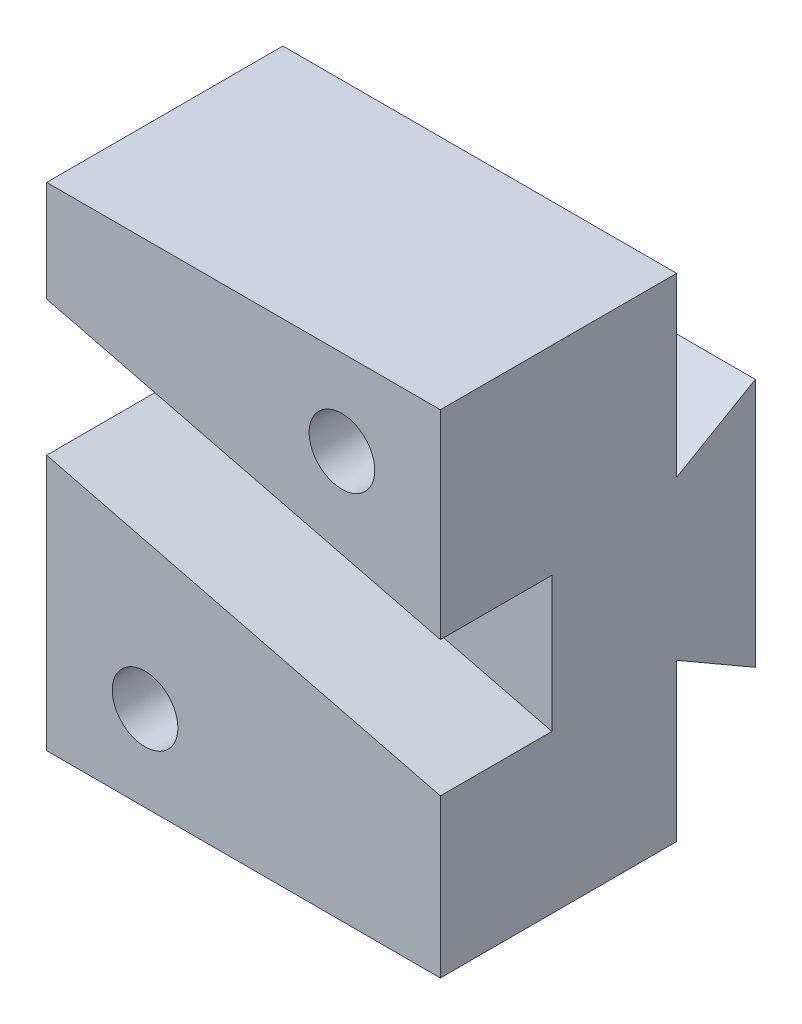
ISO-10303-21;
HEADER;
FILE_DESCRIPTION(('STEP AP214'),'2;1');
FILE_NAME('part.step','',(''),(''),'','','');
FILE_SCHEMA(('AUTOMOTIVE_DESIGN { 1 0 10303 214 1 1 1 1 }'));
ENDSEC;
DATA;
#1=APPLICATION_CONTEXT('core data for automotive mechanical design processes');
#2=APPLICATION_PROTOCOL_DEFINITION('international standard','automotive_design',2000,#1);
#3=PRODUCT_CONTEXT('',#1,'mechanical');
#4=PRODUCT('Part','Part','',(#3));
#5=PRODUCT_RELATED_PRODUCT_CATEGORY('part','',(#4));
#6=PRODUCT_DEFINITION_FORMATION('','',#4);
#7=PRODUCT_DEFINITION_CONTEXT('part definition',#1,'design');
#8=PRODUCT_DEFINITION('design','',#6,#7);
#9=PRODUCT_DEFINITION_SHAPE('','',#8);
#10=(LENGTH_UNIT() NAMED_UNIT(*) SI_UNIT(.MILLI.,.METRE.));
#11=(NAMED_UNIT(*) PLANE_ANGLE_UNIT() SI_UNIT($,.RADIAN.));
#12=(NAMED_UNIT(*) SI_UNIT($,.STERADIAN.) SOLID_ANGLE_UNIT());
#13=UNCERTAINTY_MEASURE_WITH_UNIT(LENGTH_MEASURE(1.E-05),#10,'distance_accuracy_value','');
#14=(GEOMETRIC_REPRESENTATION_CONTEXT(3) GLOBAL_UNCERTAINTY_ASSIGNED_CONTEXT((#13)) GLOBAL_UNIT_ASSIGNED_CONTEXT((#10,
#11,#12)) REPRESENTATION_CONTEXT('',''));
#15=CARTESIAN_POINT('',(0.,0.,0.));
#16=DIRECTION('',(0.,0.,1.));
#17=DIRECTION('',(1.,0.,0.));
#18=AXIS2_PLACEMENT_3D('',#15,#16,#17);
#19=CARTESIAN_POINT('',(60.,0.,36.));
#20=DIRECTION('',(0.,0.,-1.));
#21=DIRECTION('',(-1.,0.,0.));
#22=AXIS2_PLACEMENT_3D('',#19,#20,#21);
#23=PLANE('',#22);
#24=CARTESIAN_POINT('',(45.,62.,36.));
#25=DIRECTION('',(0.,0.,1.));
#26=DIRECTION('',(1.,0.,0.));
#27=AXIS2_PLACEMENT_3D('',#24,#25,#26);
#28=CIRCLE('',#27,5.);
#29=CARTESIAN_POINT('',(50.,62.,36.));
#30=VERTEX_POINT('',#29);
#31=EDGE_CURVE('E231',#30,#30,#28,.T.);
#32=ORIENTED_EDGE('',*,*,#31,.F.);
#33=EDGE_LOOP('',(#32));
#34=FACE_BOUND('',#33,.T.);
#35=DIRECTION('',(0.970295726275997,-0.241921895599665,0.));
#36=VECTOR('',#35,1.);
#37=CARTESIAN_POINT('',(0.,59.6122725869979,36.));
#38=LINE('',#37,#36);
#39=CARTESIAN_POINT('',(0.,59.6122725869979,36.));
#40=VERTEX_POINT('',#39);
#41=CARTESIAN_POINT('',(60.,44.6525924164073,36.));
#42=VERTEX_POINT('',#41);
#43=EDGE_CURVE('E213',#40,#42,#38,.T.);
#44=ORIENTED_EDGE('',*,*,#43,.T.);
#45=DIRECTION('',(0.,-1.,0.));
#46=VECTOR('',#45,1.);
#47=CARTESIAN_POINT('',(60.,0.,36.));
#48=LINE('',#47,#46);
#49=CARTESIAN_POINT('',(60.,75.,36.));
#50=VERTEX_POINT('',#49);
#51=EDGE_CURVE('E196',#50,#42,#48,.T.);
#52=ORIENTED_EDGE('',*,*,#51,.F.);
#53=DIRECTION('',(-1.,0.,0.));
#54=VECTOR('',#53,1.);
#55=CARTESIAN_POINT('',(60.,75.,36.));
#56=LINE('',#55,#54);
#57=CARTESIAN_POINT('',(0.,75.,36.));
#58=VERTEX_POINT('',#57);
#59=EDGE_CURVE('E140',#50,#58,#56,.T.);
#60=ORIENTED_EDGE('',*,*,#59,.T.);
#61=DIRECTION('',(0.,-1.,0.));
#62=VECTOR('',#61,1.);
#63=CARTESIAN_POINT('',(0.,0.,36.));
#64=LINE('',#63,#62);
#65=EDGE_CURVE('E144',#58,#40,#64,.T.);
#66=ORIENTED_EDGE('',*,*,#65,.T.);
#67=EDGE_LOOP('',(#44,#52,#60,#66));
#68=FACE_BOUND('',#67,.T.);
#69=ADVANCED_FACE('F33',(#34,#68),#23,.F.);
#70=CARTESIAN_POINT('',(60.,0.,0.));
#71=DIRECTION('',(-1.,0.,0.));
#72=DIRECTION('',(0.,0.,1.));
#73=AXIS2_PLACEMENT_3D('',#70,#71,#72);
#74=PLANE('',#73);
#75=DIRECTION('',(0.,0.,1.));
#76=VECTOR('',#75,1.);
#77=CARTESIAN_POINT('',(60.,44.6525924164073,19.));
#78=LINE('',#77,#76);
#79=CARTESIAN_POINT('',(60.,44.6525924164073,19.));
#80=VERTEX_POINT('',#79);
#81=EDGE_CURVE('E198',#80,#42,#78,.T.);
#82=ORIENTED_EDGE('',*,*,#81,.F.);
#83=DIRECTION('',(0.,-1.,0.));
#84=VECTOR('',#83,1.);
#85=CARTESIAN_POINT('',(60.,44.6525924164073,19.));
#86=LINE('',#85,#84);
#87=CARTESIAN_POINT('',(60.,24.0403198294093,19.));
#88=VERTEX_POINT('',#87);
#89=EDGE_CURVE('E221',#80,#88,#86,.T.);
#90=ORIENTED_EDGE('',*,*,#89,.T.);
#91=DIRECTION('',(0.,0.,1.));
#92=VECTOR('',#91,1.);
#93=CARTESIAN_POINT('',(60.,24.0403198294093,19.));
#94=LINE('',#93,#92);
#95=CARTESIAN_POINT('',(60.,24.0403198294093,36.));
#96=VERTEX_POINT('',#95);
#97=EDGE_CURVE('E201',#88,#96,#94,.T.);
#98=ORIENTED_EDGE('',*,*,#97,.T.);
#99=CARTESIAN_POINT('',(60.,0.,36.));
#100=VERTEX_POINT('',#99);
#101=EDGE_CURVE('E98',#96,#100,#48,.T.);
#102=ORIENTED_EDGE('',*,*,#101,.T.);
#103=DIRECTION('',(0.,0.,-1.));
#104=VECTOR('',#103,1.);
#105=CARTESIAN_POINT('',(60.,0.,0.));
#106=LINE('',#105,#104);
#107=CARTESIAN_POINT('',(60.,0.,0.));
#108=VERTEX_POINT('',#107);
#109=EDGE_CURVE('E194',#100,#108,#106,.T.);
#110=ORIENTED_EDGE('',*,*,#109,.T.);
#111=DIRECTION('',(0.,1.,0.));
#112=VECTOR('',#111,1.);
#113=CARTESIAN_POINT('',(60.,23.9282032302756,0.));
#114=LINE('',#113,#112);
#115=CARTESIAN_POINT('',(60.,23.9282032302756,0.));
#116=VERTEX_POINT('',#115);
#117=EDGE_CURVE('E175',#108,#116,#114,.T.);
#118=ORIENTED_EDGE('',*,*,#117,.T.);
#119=DIRECTION('',(0.,-0.500000000000003,-0.866025403784437));
#120=VECTOR('',#119,1.);
#121=CARTESIAN_POINT('',(60.,17.,-12.));
#122=LINE('',#121,#120);
#123=CARTESIAN_POINT('',(60.,17.,-12.));
#124=VERTEX_POINT('',#123);
#125=EDGE_CURVE('E190',#116,#124,#122,.T.);
#126=ORIENTED_EDGE('',*,*,#125,.T.);
#127=DIRECTION('',(0.,1.,0.));
#128=VECTOR('',#127,1.);
#129=CARTESIAN_POINT('',(60.,55.,-12.));
#130=LINE('',#129,#128);
#131=CARTESIAN_POINT('',(60.,55.,-12.));
#132=VERTEX_POINT('',#131);
#133=EDGE_CURVE('E123',#124,#132,#130,.T.);
#134=ORIENTED_EDGE('',*,*,#133,.T.);
#135=DIRECTION('',(0.,-0.500000000000011,0.866025403784432));
#136=VECTOR('',#135,1.);
#137=CARTESIAN_POINT('',(60.,48.0717967697243,0.));
#138=LINE('',#137,#136);
#139=CARTESIAN_POINT('',(60.,48.0717967697243,0.));
#140=VERTEX_POINT('',#139);
#141=EDGE_CURVE('E115',#132,#140,#138,.T.);
#142=ORIENTED_EDGE('',*,*,#141,.T.);
#143=DIRECTION('',(0.,1.,0.));
#144=VECTOR('',#143,1.);
#145=CARTESIAN_POINT('',(60.,75.,0.));
#146=LINE('',#145,#144);
#147=CARTESIAN_POINT('',(60.,75.,0.));
#148=VERTEX_POINT('',#147);
#149=EDGE_CURVE('E120',#140,#148,#146,.T.);
#150=ORIENTED_EDGE('',*,*,#149,.T.);
#151=DIRECTION('',(0.,0.,1.));
#152=VECTOR('',#151,1.);
#153=CARTESIAN_POINT('',(60.,75.,36.));
#154=LINE('',#153,#152);
#155=EDGE_CURVE('E57',#148,#50,#154,.T.);
#156=ORIENTED_EDGE('',*,*,#155,.T.);
#157=ORIENTED_EDGE('',*,*,#51,.T.);
#158=EDGE_LOOP('',(#82,#90,#98,#102,#110,#118,#126,#134,#142,#150,#156,#157));
#159=FACE_BOUND('',#158,.T.);
#160=ADVANCED_FACE('F118',(#159),#74,.F.);
#161=CARTESIAN_POINT('',(0.,0.,0.));
#162=DIRECTION('',(-1.,0.,0.));
#163=DIRECTION('',(0.,0.,1.));
#164=AXIS2_PLACEMENT_3D('',#161,#162,#163);
#165=PLANE('',#164);
#166=DIRECTION('',(0.,-1.,0.));
#167=VECTOR('',#166,1.);
#168=CARTESIAN_POINT('',(0.,59.6122725869979,19.));
#169=LINE('',#168,#167);
#170=CARTESIAN_POINT('',(0.,59.6122725869979,19.));
#171=VERTEX_POINT('',#170);
#172=CARTESIAN_POINT('',(0.,39.,19.));
#173=VERTEX_POINT('',#172);
#174=EDGE_CURVE('E209',#171,#173,#169,.T.);
#175=ORIENTED_EDGE('',*,*,#174,.F.);
#176=DIRECTION('',(0.,0.,1.));
#177=VECTOR('',#176,1.);
#178=CARTESIAN_POINT('',(0.,59.6122725869979,19.));
#179=LINE('',#178,#177);
#180=EDGE_CURVE('E206',#171,#40,#179,.T.);
#181=ORIENTED_EDGE('',*,*,#180,.T.);
#182=ORIENTED_EDGE('',*,*,#65,.F.);
#183=DIRECTION('',(0.,0.,1.));
#184=VECTOR('',#183,1.);
#185=CARTESIAN_POINT('',(0.,75.,36.));
#186=LINE('',#185,#184);
#187=CARTESIAN_POINT('',(0.,75.,0.));
#188=VERTEX_POINT('',#187);
#189=EDGE_CURVE('E90',#188,#58,#186,.T.);
#190=ORIENTED_EDGE('',*,*,#189,.F.);
#191=DIRECTION('',(0.,1.,0.));
#192=VECTOR('',#191,1.);
#193=CARTESIAN_POINT('',(0.,75.,0.));
#194=LINE('',#193,#192);
#195=CARTESIAN_POINT('',(0.,48.0717967697243,0.));
#196=VERTEX_POINT('',#195);
#197=EDGE_CURVE('E157',#196,#188,#194,.T.);
#198=ORIENTED_EDGE('',*,*,#197,.F.);
#199=DIRECTION('',(0.,-0.500000000000011,0.866025403784432));
#200=VECTOR('',#199,1.);
#201=CARTESIAN_POINT('',(0.,48.0717967697243,0.));
#202=LINE('',#201,#200);
#203=CARTESIAN_POINT('',(0.,55.,-12.));
#204=VERTEX_POINT('',#203);
#205=EDGE_CURVE('E132',#204,#196,#202,.T.);
#206=ORIENTED_EDGE('',*,*,#205,.F.);
#207=DIRECTION('',(0.,1.,0.));
#208=VECTOR('',#207,1.);
#209=CARTESIAN_POINT('',(0.,55.,-12.));
#210=LINE('',#209,#208);
#211=CARTESIAN_POINT('',(0.,17.,-12.));
#212=VERTEX_POINT('',#211);
#213=EDGE_CURVE('E154',#212,#204,#210,.T.);
#214=ORIENTED_EDGE('',*,*,#213,.F.);
#215=DIRECTION('',(0.,-0.500000000000003,-0.866025403784437));
#216=VECTOR('',#215,1.);
#217=CARTESIAN_POINT('',(0.,17.,-12.));
#218=LINE('',#217,#216);
#219=CARTESIAN_POINT('',(0.,23.9282032302756,0.));
#220=VERTEX_POINT('',#219);
#221=EDGE_CURVE('E152',#220,#212,#218,.T.);
#222=ORIENTED_EDGE('',*,*,#221,.F.);
#223=DIRECTION('',(0.,1.,0.));
#224=VECTOR('',#223,1.);
#225=CARTESIAN_POINT('',(0.,23.9282032302756,0.));
#226=LINE('',#225,#224);
#227=CARTESIAN_POINT('',(0.,0.,0.));
#228=VERTEX_POINT('',#227);
#229=EDGE_CURVE('E150',#228,#220,#226,.T.);
#230=ORIENTED_EDGE('',*,*,#229,.F.);
#231=DIRECTION('',(0.,0.,-1.));
#232=VECTOR('',#231,1.);
#233=CARTESIAN_POINT('',(0.,0.,0.));
#234=LINE('',#233,#232);
#235=CARTESIAN_POINT('',(0.,0.,36.));
#236=VERTEX_POINT('',#235);
#237=EDGE_CURVE('E147',#236,#228,#234,.T.);
#238=ORIENTED_EDGE('',*,*,#237,.F.);
#239=CARTESIAN_POINT('',(0.,39.,36.));
#240=VERTEX_POINT('',#239);
#241=EDGE_CURVE('E148',#240,#236,#64,.T.);
#242=ORIENTED_EDGE('',*,*,#241,.F.);
#243=DIRECTION('',(0.,0.,1.));
#244=VECTOR('',#243,1.);
#245=CARTESIAN_POINT('',(0.,39.,19.));
#246=LINE('',#245,#244);
#247=EDGE_CURVE('E203',#173,#240,#246,.T.);
#248=ORIENTED_EDGE('',*,*,#247,.F.);
#249=EDGE_LOOP('',(#175,#181,#182,#190,#198,#206,#214,#222,#230,#238,#242,#248));
#250=FACE_BOUND('',#249,.T.);
#251=ADVANCED_FACE('F181',(#250),#165,.T.);
#252=CARTESIAN_POINT('',(15.,13.,36.));
#253=DIRECTION('',(0.,0.,1.));
#254=DIRECTION('',(1.,0.,0.));
#255=AXIS2_PLACEMENT_3D('',#252,#253,#254);
#256=CIRCLE('',#255,5.);
#257=CARTESIAN_POINT('',(20.,13.,36.));
#258=VERTEX_POINT('',#257);
#259=EDGE_CURVE('E225',#258,#258,#256,.T.);
#260=ORIENTED_EDGE('',*,*,#259,.F.);
#261=EDGE_LOOP('',(#260));
#262=FACE_BOUND('',#261,.T.);
#263=ORIENTED_EDGE('',*,*,#101,.F.);
#264=DIRECTION('',(0.970295726275997,-0.241921895599665,0.));
#265=VECTOR('',#264,1.);
#266=CARTESIAN_POINT('',(0.,39.,36.));
#267=LINE('',#266,#265);
#268=EDGE_CURVE('E210',#240,#96,#267,.T.);
#269=ORIENTED_EDGE('',*,*,#268,.F.);
#270=ORIENTED_EDGE('',*,*,#241,.T.);
#271=DIRECTION('',(-1.,0.,0.));
#272=VECTOR('',#271,1.);
#273=CARTESIAN_POINT('',(60.,0.,36.));
#274=LINE('',#273,#272);
#275=EDGE_CURVE('E11',#100,#236,#274,.T.);
#276=ORIENTED_EDGE('',*,*,#275,.F.);
#277=EDGE_LOOP('',(#263,#269,#270,#276));
#278=FACE_BOUND('',#277,.T.);
#279=ADVANCED_FACE('F35',(#262,#278),#23,.F.);
#280=CARTESIAN_POINT('',(60.,0.,0.));
#281=DIRECTION('',(0.,1.,0.));
#282=DIRECTION('',(0.,0.,1.));
#283=AXIS2_PLACEMENT_3D('',#280,#281,#282);
#284=PLANE('',#283);
#285=ORIENTED_EDGE('',*,*,#237,.T.);
#286=DIRECTION('',(-1.,0.,0.));
#287=VECTOR('',#286,1.);
#288=CARTESIAN_POINT('',(60.,0.,0.));
#289=LINE('',#288,#287);
#290=EDGE_CURVE('E41',#108,#228,#289,.T.);
#291=ORIENTED_EDGE('',*,*,#290,.F.);
#292=ORIENTED_EDGE('',*,*,#109,.F.);
#293=ORIENTED_EDGE('',*,*,#275,.T.);
#294=EDGE_LOOP('',(#285,#291,#292,#293));
#295=FACE_BOUND('',#294,.T.);
#296=ADVANCED_FACE('F266',(#295),#284,.F.);
#297=CARTESIAN_POINT('',(60.,23.9282032302756,0.));
#298=DIRECTION('',(0.,0.,1.));
#299=DIRECTION('',(0.,-1.,0.));
#300=AXIS2_PLACEMENT_3D('',#297,#298,#299);
#301=PLANE('',#300);
#302=CARTESIAN_POINT('',(15.,13.,0.));
#303=DIRECTION('',(0.,0.,1.));
#304=DIRECTION('',(0.,-1.,0.));
#305=AXIS2_PLACEMENT_3D('',#302,#303,#304);
#306=CIRCLE('',#305,5.);
#307=CARTESIAN_POINT('',(15.,7.99999999999999,0.));
#308=VERTEX_POINT('',#307);
#309=EDGE_CURVE('E228',#308,#308,#306,.F.);
#310=ORIENTED_EDGE('',*,*,#309,.F.);
#311=EDGE_LOOP('',(#310));
#312=FACE_BOUND('',#311,.T.);
#313=ORIENTED_EDGE('',*,*,#229,.T.);
#314=DIRECTION('',(-1.,0.,0.));
#315=VECTOR('',#314,1.);
#316=CARTESIAN_POINT('',(60.,23.9282032302756,0.));
#317=LINE('',#316,#315);
#318=EDGE_CURVE('E166',#116,#220,#317,.T.);
#319=ORIENTED_EDGE('',*,*,#318,.F.);
#320=ORIENTED_EDGE('',*,*,#117,.F.);
#321=ORIENTED_EDGE('',*,*,#290,.T.);
#322=EDGE_LOOP('',(#313,#319,#320,#321));
#323=FACE_BOUND('',#322,.T.);
#324=ADVANCED_FACE('F173',(#312,#323),#301,.F.);
#325=CARTESIAN_POINT('',(60.,17.,-12.));
#326=DIRECTION('',(0.,0.866025403784437,-0.500000000000003));
#327=DIRECTION('',(0.,0.500000000000003,0.866025403784437));
#328=AXIS2_PLACEMENT_3D('',#325,#326,#327);
#329=PLANE('',#328);
#330=ORIENTED_EDGE('',*,*,#221,.T.);
#331=DIRECTION('',(-1.,0.,0.));
#332=VECTOR('',#331,1.);
#333=CARTESIAN_POINT('',(60.,17.,-12.));
#334=LINE('',#333,#332);
#335=EDGE_CURVE('E163',#124,#212,#334,.T.);
#336=ORIENTED_EDGE('',*,*,#335,.F.);
#337=ORIENTED_EDGE('',*,*,#125,.F.);
#338=ORIENTED_EDGE('',*,*,#318,.T.);
#339=EDGE_LOOP('',(#330,#336,#337,#338));
#340=FACE_BOUND('',#339,.T.);
#341=ADVANCED_FACE('F186',(#340),#329,.F.);
#342=CARTESIAN_POINT('',(60.,55.,-12.));
#343=DIRECTION('',(0.,0.,1.));
#344=DIRECTION('',(0.,-1.,0.));
#345=AXIS2_PLACEMENT_3D('',#342,#343,#344);
#346=PLANE('',#345);
#347=ORIENTED_EDGE('',*,*,#213,.T.);
#348=DIRECTION('',(-1.,0.,0.));
#349=VECTOR('',#348,1.);
#350=CARTESIAN_POINT('',(60.,55.,-12.));
#351=LINE('',#350,#349);
#352=EDGE_CURVE('E135',#132,#204,#351,.T.);
#353=ORIENTED_EDGE('',*,*,#352,.F.);
#354=ORIENTED_EDGE('',*,*,#133,.F.);
#355=ORIENTED_EDGE('',*,*,#335,.T.);
#356=EDGE_LOOP('',(#347,#353,#354,#355));
#357=FACE_BOUND('',#356,.T.);
#358=ADVANCED_FACE('F189',(#357),#346,.F.);
#359=CARTESIAN_POINT('',(60.,48.0717967697243,0.));
#360=DIRECTION('',(0.,-0.866025403784432,-0.500000000000011));
#361=DIRECTION('',(0.,0.500000000000011,-0.866025403784432));
#362=AXIS2_PLACEMENT_3D('',#359,#360,#361);
#363=PLANE('',#362);
#364=ORIENTED_EDGE('',*,*,#205,.T.);
#365=DIRECTION('',(-1.,0.,0.));
#366=VECTOR('',#365,1.);
#367=CARTESIAN_POINT('',(60.,48.0717967697243,0.));
#368=LINE('',#367,#366);
#369=EDGE_CURVE('E129',#140,#196,#368,.T.);
#370=ORIENTED_EDGE('',*,*,#369,.F.);
#371=ORIENTED_EDGE('',*,*,#141,.F.);
#372=ORIENTED_EDGE('',*,*,#352,.T.);
#373=EDGE_LOOP('',(#364,#370,#371,#372));
#374=FACE_BOUND('',#373,.T.);
#375=ADVANCED_FACE('F130',(#374),#363,.F.);
#376=CARTESIAN_POINT('',(60.,75.,0.));
#377=DIRECTION('',(0.,0.,1.));
#378=DIRECTION('',(0.,-1.,0.));
#379=AXIS2_PLACEMENT_3D('',#376,#377,#378);
#380=PLANE('',#379);
#381=CARTESIAN_POINT('',(45.,62.,0.));
#382=DIRECTION('',(0.,0.,1.));
#383=DIRECTION('',(0.,-1.,0.));
#384=AXIS2_PLACEMENT_3D('',#381,#382,#383);
#385=CIRCLE('',#384,5.);
#386=CARTESIAN_POINT('',(45.,57.,0.));
#387=VERTEX_POINT('',#386);
#388=EDGE_CURVE('E216',#387,#387,#385,.F.);
#389=ORIENTED_EDGE('',*,*,#388,.F.);
#390=EDGE_LOOP('',(#389));
#391=FACE_BOUND('',#390,.T.);
#392=ORIENTED_EDGE('',*,*,#197,.T.);
#393=DIRECTION('',(-1.,0.,0.));
#394=VECTOR('',#393,1.);
#395=CARTESIAN_POINT('',(60.,75.,0.));
#396=LINE('',#395,#394);
#397=EDGE_CURVE('E136',#148,#188,#396,.T.);
#398=ORIENTED_EDGE('',*,*,#397,.F.);
#399=ORIENTED_EDGE('',*,*,#149,.F.);
#400=ORIENTED_EDGE('',*,*,#369,.T.);
#401=EDGE_LOOP('',(#392,#398,#399,#400));
#402=FACE_BOUND('',#401,.T.);
#403=ADVANCED_FACE('F138',(#391,#402),#380,.F.);
#404=CARTESIAN_POINT('',(60.,75.,36.));
#405=DIRECTION('',(0.,-1.,0.));
#406=DIRECTION('',(0.,0.,-1.));
#407=AXIS2_PLACEMENT_3D('',#404,#405,#406);
#408=PLANE('',#407);
#409=ORIENTED_EDGE('',*,*,#189,.T.);
#410=ORIENTED_EDGE('',*,*,#59,.F.);
#411=ORIENTED_EDGE('',*,*,#155,.F.);
#412=ORIENTED_EDGE('',*,*,#397,.T.);
#413=EDGE_LOOP('',(#409,#410,#411,#412));
#414=FACE_BOUND('',#413,.T.);
#415=ADVANCED_FACE('F284',(#414),#408,.F.);
#416=CARTESIAN_POINT('',(0.,59.6122725869979,19.));
#417=DIRECTION('',(-0.241921895599665,-0.970295726275997,0.));
#418=DIRECTION('',(0.970295726275997,-0.241921895599665,0.));
#419=AXIS2_PLACEMENT_3D('',#416,#417,#418);
#420=PLANE('',#419);
#421=ORIENTED_EDGE('',*,*,#43,.F.);
#422=ORIENTED_EDGE('',*,*,#180,.F.);
#423=DIRECTION('',(0.970295726275997,-0.241921895599665,0.));
#424=VECTOR('',#423,1.);
#425=CARTESIAN_POINT('',(0.,59.6122725869979,19.));
#426=LINE('',#425,#424);
#427=EDGE_CURVE('E48',#171,#80,#426,.T.);
#428=ORIENTED_EDGE('',*,*,#427,.T.);
#429=ORIENTED_EDGE('',*,*,#81,.T.);
#430=EDGE_LOOP('',(#421,#422,#428,#429));
#431=FACE_BOUND('',#430,.T.);
#432=ADVANCED_FACE('F252',(#431),#420,.T.);
#433=CARTESIAN_POINT('',(0.,39.,19.));
#434=DIRECTION('',(-0.241921895599665,-0.970295726275997,0.));
#435=DIRECTION('',(0.970295726275997,-0.241921895599665,0.));
#436=AXIS2_PLACEMENT_3D('',#433,#434,#435);
#437=PLANE('',#436);
#438=ORIENTED_EDGE('',*,*,#268,.T.);
#439=ORIENTED_EDGE('',*,*,#97,.F.);
#440=DIRECTION('',(0.970295726275997,-0.241921895599665,0.));
#441=VECTOR('',#440,1.);
#442=CARTESIAN_POINT('',(0.,39.,19.));
#443=LINE('',#442,#441);
#444=EDGE_CURVE('E218',#173,#88,#443,.T.);
#445=ORIENTED_EDGE('',*,*,#444,.F.);
#446=ORIENTED_EDGE('',*,*,#247,.T.);
#447=EDGE_LOOP('',(#438,#439,#445,#446));
#448=FACE_BOUND('',#447,.T.);
#449=ADVANCED_FACE('F263',(#448),#437,.F.);
#450=CARTESIAN_POINT('',(0.,0.,19.));
#451=DIRECTION('',(0.,0.,-1.));
#452=DIRECTION('',(-1.,0.,0.));
#453=AXIS2_PLACEMENT_3D('',#450,#451,#452);
#454=PLANE('',#453);
#455=ORIENTED_EDGE('',*,*,#427,.F.);
#456=ORIENTED_EDGE('',*,*,#174,.T.);
#457=ORIENTED_EDGE('',*,*,#444,.T.);
#458=ORIENTED_EDGE('',*,*,#89,.F.);
#459=EDGE_LOOP('',(#455,#456,#457,#458));
#460=FACE_BOUND('',#459,.T.);
#461=ADVANCED_FACE('F254',(#460),#454,.F.);
#462=CARTESIAN_POINT('',(45.,62.,-12.001));
#463=DIRECTION('',(0.,0.,1.));
#464=DIRECTION('',(1.,0.,0.));
#465=AXIS2_PLACEMENT_3D('',#462,#463,#464);
#466=CYLINDRICAL_SURFACE('',#465,5.);
#467=ORIENTED_EDGE('',*,*,#31,.T.);
#468=EDGE_LOOP('',(#467));
#469=FACE_BOUND('',#468,.T.);
#470=ORIENTED_EDGE('',*,*,#388,.T.);
#471=EDGE_LOOP('',(#470));
#472=FACE_BOUND('',#471,.T.);
#473=ADVANCED_FACE('F237',(#469,#472),#466,.F.);
#474=CARTESIAN_POINT('',(15.,13.,-12.001));
#475=DIRECTION('',(0.,0.,1.));
#476=DIRECTION('',(1.,0.,0.));
#477=AXIS2_PLACEMENT_3D('',#474,#475,#476);
#478=CYLINDRICAL_SURFACE('',#477,5.);
#479=ORIENTED_EDGE('',*,*,#259,.T.);
#480=EDGE_LOOP('',(#479));
#481=FACE_BOUND('',#480,.T.);
#482=ORIENTED_EDGE('',*,*,#309,.T.);
#483=EDGE_LOOP('',(#482));
#484=FACE_BOUND('',#483,.T.);
#485=ADVANCED_FACE('F298',(#481,#484),#478,.F.);
#486=CLOSED_SHELL('',(#69,#160,#251,#279,#296,#324,#341,#358,#375,#403,#415,#432,#449,#461,#473,#485));
#487=MANIFOLD_SOLID_BREP('B2',#486);
#488=ADVANCED_BREP_SHAPE_REPRESENTATION('',(#18,#487),#14);
#489=SHAPE_DEFINITION_REPRESENTATION(#9,#488);
ENDSEC;
END-ISO-10303-21;
